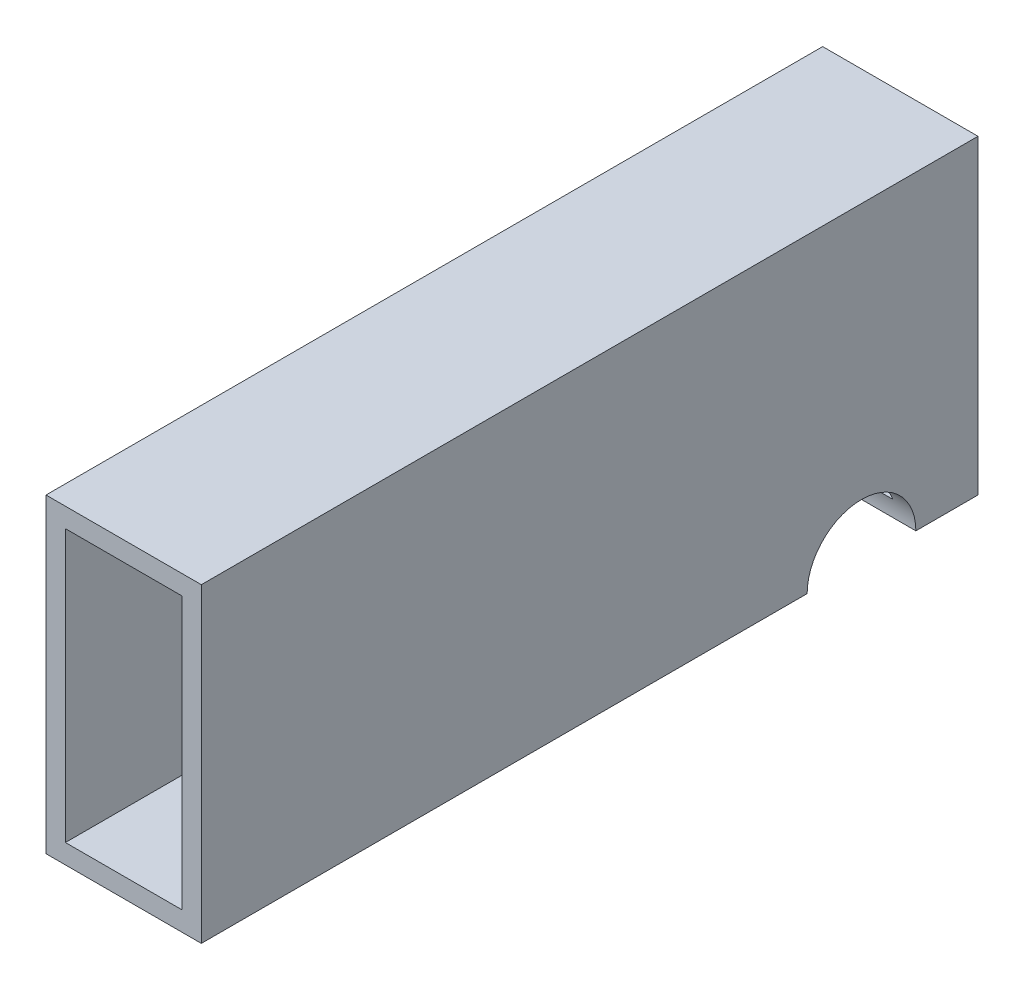
ISO-10303-21;
HEADER;
FILE_DESCRIPTION(('STEP AP214'),'2;1');
FILE_NAME('part.step','',(''),(''),'','','');
FILE_SCHEMA(('AUTOMOTIVE_DESIGN { 1 0 10303 214 1 1 1 1 }'));
ENDSEC;
DATA;
#1=APPLICATION_CONTEXT('core data for automotive mechanical design processes');
#2=APPLICATION_PROTOCOL_DEFINITION('international standard','automotive_design',2000,#1);
#3=PRODUCT_CONTEXT('',#1,'mechanical');
#4=PRODUCT('Part','Part','',(#3));
#5=PRODUCT_RELATED_PRODUCT_CATEGORY('part','',(#4));
#6=PRODUCT_DEFINITION_FORMATION('','',#4);
#7=PRODUCT_DEFINITION_CONTEXT('part definition',#1,'design');
#8=PRODUCT_DEFINITION('design','',#6,#7);
#9=PRODUCT_DEFINITION_SHAPE('','',#8);
#10=(LENGTH_UNIT() NAMED_UNIT(*) SI_UNIT(.MILLI.,.METRE.));
#11=(NAMED_UNIT(*) PLANE_ANGLE_UNIT() SI_UNIT($,.RADIAN.));
#12=(NAMED_UNIT(*) SI_UNIT($,.STERADIAN.) SOLID_ANGLE_UNIT());
#13=UNCERTAINTY_MEASURE_WITH_UNIT(LENGTH_MEASURE(1.E-05),#10,'distance_accuracy_value','');
#14=(GEOMETRIC_REPRESENTATION_CONTEXT(3) GLOBAL_UNCERTAINTY_ASSIGNED_CONTEXT((#13)) GLOBAL_UNIT_ASSIGNED_CONTEXT((#10,
#11,#12)) REPRESENTATION_CONTEXT('',''));
#15=CARTESIAN_POINT('',(0.,0.,0.));
#16=DIRECTION('',(0.,0.,1.));
#17=DIRECTION('',(1.,0.,0.));
#18=AXIS2_PLACEMENT_3D('',#15,#16,#17);
#19=CARTESIAN_POINT('',(-12.7,-25.4,63.5));
#20=DIRECTION('',(0.,1.,0.));
#21=DIRECTION('',(0.,0.,1.));
#22=AXIS2_PLACEMENT_3D('',#19,#20,#21);
#23=PLANE('',#22);
#24=DIRECTION('',(0.,0.,-1.));
#25=VECTOR('',#24,1.);
#26=CARTESIAN_POINT('',(-12.7,-25.4,63.5));
#27=LINE('',#26,#25);
#28=CARTESIAN_POINT('',(-12.7,-25.4,63.5));
#29=VERTEX_POINT('',#28);
#30=CARTESIAN_POINT('',(-12.7,-25.4,-35.56));
#31=VERTEX_POINT('',#30);
#32=EDGE_CURVE('E134',#29,#31,#27,.T.);
#33=ORIENTED_EDGE('',*,*,#32,.T.);
#34=DIRECTION('',(1.,0.,0.));
#35=VECTOR('',#34,1.);
#36=CARTESIAN_POINT('',(-12.7,-25.4,-35.56));
#37=LINE('',#36,#35);
#38=CARTESIAN_POINT('',(12.7,-25.4,-35.56));
#39=VERTEX_POINT('',#38);
#40=EDGE_CURVE('E118',#31,#39,#37,.T.);
#41=ORIENTED_EDGE('',*,*,#40,.T.);
#42=DIRECTION('',(0.,0.,-1.));
#43=VECTOR('',#42,1.);
#44=CARTESIAN_POINT('',(12.7,-25.4,63.5));
#45=LINE('',#44,#43);
#46=CARTESIAN_POINT('',(12.7,-25.4,63.5));
#47=VERTEX_POINT('',#46);
#48=EDGE_CURVE('E145',#47,#39,#45,.T.);
#49=ORIENTED_EDGE('',*,*,#48,.F.);
#50=DIRECTION('',(1.,0.,0.));
#51=VECTOR('',#50,1.);
#52=CARTESIAN_POINT('',(-12.7,-25.4,63.5));
#53=LINE('',#52,#51);
#54=EDGE_CURVE('E140',#29,#47,#53,.T.);
#55=ORIENTED_EDGE('',*,*,#54,.F.);
#56=EDGE_LOOP('',(#33,#41,#49,#55));
#57=FACE_BOUND('',#56,.T.);
#58=ADVANCED_FACE('F32',(#57),#23,.F.);
#59=CARTESIAN_POINT('',(-9.525,-22.225,63.5));
#60=DIRECTION('',(0.,1.,0.));
#61=DIRECTION('',(-1.,0.,0.));
#62=AXIS2_PLACEMENT_3D('',#59,#60,#61);
#63=PLANE('',#62);
#64=DIRECTION('',(1.,0.,0.));
#65=VECTOR('',#64,1.);
#66=CARTESIAN_POINT('',(-12.7,-22.225,-36.146297512555));
#67=LINE('',#66,#65);
#68=CARTESIAN_POINT('',(-9.525,-22.225,-36.146297512555));
#69=VERTEX_POINT('',#68);
#70=CARTESIAN_POINT('',(9.52500000000001,-22.225,-36.146297512555));
#71=VERTEX_POINT('',#70);
#72=EDGE_CURVE('E54',#69,#71,#67,.T.);
#73=ORIENTED_EDGE('',*,*,#72,.F.);
#74=DIRECTION('',(0.,0.,-1.));
#75=VECTOR('',#74,1.);
#76=CARTESIAN_POINT('',(-9.525,-22.225,63.5));
#77=LINE('',#76,#75);
#78=CARTESIAN_POINT('',(-9.525,-22.225,63.5));
#79=VERTEX_POINT('',#78);
#80=EDGE_CURVE('E166',#79,#69,#77,.T.);
#81=ORIENTED_EDGE('',*,*,#80,.F.);
#82=DIRECTION('',(1.,0.,0.));
#83=VECTOR('',#82,1.);
#84=CARTESIAN_POINT('',(-9.525,-22.225,63.5));
#85=LINE('',#84,#83);
#86=CARTESIAN_POINT('',(9.52500000000001,-22.225,63.5));
#87=VERTEX_POINT('',#86);
#88=EDGE_CURVE('E193',#79,#87,#85,.T.);
#89=ORIENTED_EDGE('',*,*,#88,.T.);
#90=DIRECTION('',(0.,0.,-1.));
#91=VECTOR('',#90,1.);
#92=CARTESIAN_POINT('',(9.52500000000001,-22.225,63.5));
#93=LINE('',#92,#91);
#94=EDGE_CURVE('E216',#87,#71,#93,.T.);
#95=ORIENTED_EDGE('',*,*,#94,.T.);
#96=EDGE_LOOP('',(#73,#81,#89,#95));
#97=FACE_BOUND('',#96,.T.);
#98=ADVANCED_FACE('F245',(#97),#63,.T.);
#99=CARTESIAN_POINT('',(0.,0.,63.5));
#100=DIRECTION('',(0.,0.,1.));
#101=DIRECTION('',(1.,0.,0.));
#102=AXIS2_PLACEMENT_3D('',#99,#100,#101);
#103=PLANE('',#102);
#104=DIRECTION('',(0.,1.,0.));
#105=VECTOR('',#104,1.);
#106=CARTESIAN_POINT('',(12.7,25.4,63.5));
#107=LINE('',#106,#105);
#108=CARTESIAN_POINT('',(12.7,25.4,63.5));
#109=VERTEX_POINT('',#108);
#110=EDGE_CURVE('E177',#47,#109,#107,.T.);
#111=ORIENTED_EDGE('',*,*,#110,.T.);
#112=DIRECTION('',(-1.,0.,0.));
#113=VECTOR('',#112,1.);
#114=CARTESIAN_POINT('',(-12.7,25.4,63.5));
#115=LINE('',#114,#113);
#116=CARTESIAN_POINT('',(-12.7,25.4,63.5));
#117=VERTEX_POINT('',#116);
#118=EDGE_CURVE('E155',#109,#117,#115,.T.);
#119=ORIENTED_EDGE('',*,*,#118,.T.);
#120=DIRECTION('',(0.,-1.,0.));
#121=VECTOR('',#120,1.);
#122=CARTESIAN_POINT('',(-12.7,25.4,63.5));
#123=LINE('',#122,#121);
#124=EDGE_CURVE('E181',#117,#29,#123,.T.);
#125=ORIENTED_EDGE('',*,*,#124,.T.);
#126=ORIENTED_EDGE('',*,*,#54,.T.);
#127=EDGE_LOOP('',(#111,#119,#125,#126));
#128=FACE_BOUND('',#127,.T.);
#129=ORIENTED_EDGE('',*,*,#88,.F.);
#130=DIRECTION('',(0.,-1.,0.));
#131=VECTOR('',#130,1.);
#132=CARTESIAN_POINT('',(-9.525,22.225,63.5));
#133=LINE('',#132,#131);
#134=CARTESIAN_POINT('',(-9.525,22.225,63.5));
#135=VERTEX_POINT('',#134);
#136=EDGE_CURVE('E191',#135,#79,#133,.T.);
#137=ORIENTED_EDGE('',*,*,#136,.F.);
#138=DIRECTION('',(-1.,0.,0.));
#139=VECTOR('',#138,1.);
#140=CARTESIAN_POINT('',(-9.525,22.225,63.5));
#141=LINE('',#140,#139);
#142=CARTESIAN_POINT('',(9.525,22.225,63.5));
#143=VERTEX_POINT('',#142);
#144=EDGE_CURVE('E199',#143,#135,#141,.T.);
#145=ORIENTED_EDGE('',*,*,#144,.F.);
#146=DIRECTION('',(0.,1.,0.));
#147=VECTOR('',#146,1.);
#148=CARTESIAN_POINT('',(9.525,22.225,63.5));
#149=LINE('',#148,#147);
#150=EDGE_CURVE('E196',#87,#143,#149,.T.);
#151=ORIENTED_EDGE('',*,*,#150,.F.);
#152=EDGE_LOOP('',(#129,#137,#145,#151));
#153=FACE_BOUND('',#152,.T.);
#154=ADVANCED_FACE('F243',(#128,#153),#103,.T.);
#155=CARTESIAN_POINT('',(0.,0.,-63.5));
#156=DIRECTION('',(0.,0.,1.));
#157=DIRECTION('',(1.,0.,0.));
#158=AXIS2_PLACEMENT_3D('',#155,#156,#157);
#159=PLANE('',#158);
#160=DIRECTION('',(0.,1.,0.));
#161=VECTOR('',#160,1.);
#162=CARTESIAN_POINT('',(12.7,25.4,-63.5));
#163=LINE('',#162,#161);
#164=CARTESIAN_POINT('',(12.7,-25.4,-63.5));
#165=VERTEX_POINT('',#164);
#166=CARTESIAN_POINT('',(12.7,25.4,-63.5));
#167=VERTEX_POINT('',#166);
#168=EDGE_CURVE('E160',#165,#167,#163,.T.);
#169=ORIENTED_EDGE('',*,*,#168,.F.);
#170=DIRECTION('',(1.,0.,0.));
#171=VECTOR('',#170,1.);
#172=CARTESIAN_POINT('',(-12.7,-25.4,-63.5));
#173=LINE('',#172,#171);
#174=CARTESIAN_POINT('',(-12.7,-25.4,-63.5));
#175=VERTEX_POINT('',#174);
#176=EDGE_CURVE('E176',#175,#165,#173,.T.);
#177=ORIENTED_EDGE('',*,*,#176,.F.);
#178=DIRECTION('',(0.,-1.,0.));
#179=VECTOR('',#178,1.);
#180=CARTESIAN_POINT('',(-12.7,25.4,-63.5));
#181=LINE('',#180,#179);
#182=CARTESIAN_POINT('',(-12.7,25.4,-63.5));
#183=VERTEX_POINT('',#182);
#184=EDGE_CURVE('E168',#183,#175,#181,.T.);
#185=ORIENTED_EDGE('',*,*,#184,.F.);
#186=DIRECTION('',(-1.,0.,0.));
#187=VECTOR('',#186,1.);
#188=CARTESIAN_POINT('',(-12.7,25.4,-63.5));
#189=LINE('',#188,#187);
#190=EDGE_CURVE('E154',#167,#183,#189,.T.);
#191=ORIENTED_EDGE('',*,*,#190,.F.);
#192=EDGE_LOOP('',(#169,#177,#185,#191));
#193=FACE_BOUND('',#192,.T.);
#194=DIRECTION('',(0.,-1.,0.));
#195=VECTOR('',#194,1.);
#196=CARTESIAN_POINT('',(-9.525,22.225,-63.5));
#197=LINE('',#196,#195);
#198=CARTESIAN_POINT('',(-9.525,22.225,-63.5));
#199=VERTEX_POINT('',#198);
#200=CARTESIAN_POINT('',(-9.525,-22.225,-63.5));
#201=VERTEX_POINT('',#200);
#202=EDGE_CURVE('E126',#199,#201,#197,.T.);
#203=ORIENTED_EDGE('',*,*,#202,.T.);
#204=DIRECTION('',(1.,0.,0.));
#205=VECTOR('',#204,1.);
#206=CARTESIAN_POINT('',(-9.525,-22.225,-63.5));
#207=LINE('',#206,#205);
#208=CARTESIAN_POINT('',(9.52500000000001,-22.225,-63.5));
#209=VERTEX_POINT('',#208);
#210=EDGE_CURVE('E204',#201,#209,#207,.T.);
#211=ORIENTED_EDGE('',*,*,#210,.T.);
#212=DIRECTION('',(0.,1.,0.));
#213=VECTOR('',#212,1.);
#214=CARTESIAN_POINT('',(9.525,22.225,-63.5));
#215=LINE('',#214,#213);
#216=CARTESIAN_POINT('',(9.525,22.225,-63.5));
#217=VERTEX_POINT('',#216);
#218=EDGE_CURVE('E207',#209,#217,#215,.T.);
#219=ORIENTED_EDGE('',*,*,#218,.T.);
#220=DIRECTION('',(-1.,0.,0.));
#221=VECTOR('',#220,1.);
#222=CARTESIAN_POINT('',(-9.525,22.225,-63.5));
#223=LINE('',#222,#221);
#224=EDGE_CURVE('E194',#217,#199,#223,.T.);
#225=ORIENTED_EDGE('',*,*,#224,.T.);
#226=EDGE_LOOP('',(#203,#211,#219,#225));
#227=FACE_BOUND('',#226,.T.);
#228=ADVANCED_FACE('F231',(#193,#227),#159,.F.);
#229=CARTESIAN_POINT('',(12.7,25.4,63.5));
#230=DIRECTION('',(-1.,0.,0.));
#231=DIRECTION('',(0.,-1.,0.));
#232=AXIS2_PLACEMENT_3D('',#229,#230,#231);
#233=PLANE('',#232);
#234=ORIENTED_EDGE('',*,*,#48,.T.);
#235=CARTESIAN_POINT('',(12.7,-25.4,-44.45));
#236=DIRECTION('',(1.,0.,0.));
#237=DIRECTION('',(0.,1.,0.));
#238=AXIS2_PLACEMENT_3D('',#235,#236,#237);
#239=CIRCLE('',#238,8.88999999999999);
#240=CARTESIAN_POINT('',(12.7,-25.4,-53.34));
#241=VERTEX_POINT('',#240);
#242=EDGE_CURVE('E121',#241,#39,#239,.T.);
#243=ORIENTED_EDGE('',*,*,#242,.F.);
#244=EDGE_CURVE('E162',#241,#165,#45,.T.);
#245=ORIENTED_EDGE('',*,*,#244,.T.);
#246=ORIENTED_EDGE('',*,*,#168,.T.);
#247=DIRECTION('',(0.,0.,-1.));
#248=VECTOR('',#247,1.);
#249=CARTESIAN_POINT('',(12.7,25.4,63.5));
#250=LINE('',#249,#248);
#251=EDGE_CURVE('E40',#109,#167,#250,.T.);
#252=ORIENTED_EDGE('',*,*,#251,.F.);
#253=ORIENTED_EDGE('',*,*,#110,.F.);
#254=EDGE_LOOP('',(#234,#243,#245,#246,#252,#253));
#255=FACE_BOUND('',#254,.T.);
#256=ADVANCED_FACE('F34',(#255),#233,.F.);
#257=CARTESIAN_POINT('',(-12.7,25.4,63.5));
#258=DIRECTION('',(0.,-1.,0.));
#259=DIRECTION('',(0.,0.,-1.));
#260=AXIS2_PLACEMENT_3D('',#257,#258,#259);
#261=PLANE('',#260);
#262=ORIENTED_EDGE('',*,*,#190,.T.);
#263=DIRECTION('',(0.,0.,-1.));
#264=VECTOR('',#263,1.);
#265=CARTESIAN_POINT('',(-12.7,25.4,63.5));
#266=LINE('',#265,#264);
#267=EDGE_CURVE('E141',#117,#183,#266,.T.);
#268=ORIENTED_EDGE('',*,*,#267,.F.);
#269=ORIENTED_EDGE('',*,*,#118,.F.);
#270=ORIENTED_EDGE('',*,*,#251,.T.);
#271=EDGE_LOOP('',(#262,#268,#269,#270));
#272=FACE_BOUND('',#271,.T.);
#273=ADVANCED_FACE('F152',(#272),#261,.F.);
#274=CARTESIAN_POINT('',(-12.7,25.4,63.5));
#275=DIRECTION('',(1.,0.,0.));
#276=DIRECTION('',(0.,1.,0.));
#277=AXIS2_PLACEMENT_3D('',#274,#275,#276);
#278=PLANE('',#277);
#279=CARTESIAN_POINT('',(-12.7,-25.4,-53.34));
#280=VERTEX_POINT('',#279);
#281=EDGE_CURVE('E137',#280,#175,#27,.T.);
#282=ORIENTED_EDGE('',*,*,#281,.F.);
#283=CARTESIAN_POINT('',(-12.7,-25.4,-44.45));
#284=DIRECTION('',(1.,0.,0.));
#285=DIRECTION('',(0.,1.,0.));
#286=AXIS2_PLACEMENT_3D('',#283,#284,#285);
#287=CIRCLE('',#286,8.88999999999999);
#288=EDGE_CURVE('E47',#280,#31,#287,.T.);
#289=ORIENTED_EDGE('',*,*,#288,.T.);
#290=ORIENTED_EDGE('',*,*,#32,.F.);
#291=ORIENTED_EDGE('',*,*,#124,.F.);
#292=ORIENTED_EDGE('',*,*,#267,.T.);
#293=ORIENTED_EDGE('',*,*,#184,.T.);
#294=EDGE_LOOP('',(#282,#289,#290,#291,#292,#293));
#295=FACE_BOUND('',#294,.T.);
#296=ADVANCED_FACE('F132',(#295),#278,.F.);
#297=ORIENTED_EDGE('',*,*,#244,.F.);
#298=DIRECTION('',(1.,0.,0.));
#299=VECTOR('',#298,1.);
#300=CARTESIAN_POINT('',(-12.7,-25.4,-53.34));
#301=LINE('',#300,#299);
#302=EDGE_CURVE('E127',#241,#280,#301,.F.);
#303=ORIENTED_EDGE('',*,*,#302,.T.);
#304=ORIENTED_EDGE('',*,*,#281,.T.);
#305=ORIENTED_EDGE('',*,*,#176,.T.);
#306=EDGE_LOOP('',(#297,#303,#304,#305));
#307=FACE_BOUND('',#306,.T.);
#308=ADVANCED_FACE('F185',(#307),#23,.F.);
#309=CARTESIAN_POINT('',(-9.525,22.225,63.5));
#310=DIRECTION('',(1.,0.,0.));
#311=DIRECTION('',(0.,1.,0.));
#312=AXIS2_PLACEMENT_3D('',#309,#310,#311);
#313=PLANE('',#312);
#314=CARTESIAN_POINT('',(-9.525,-25.4,-44.45));
#315=DIRECTION('',(1.,0.,0.));
#316=DIRECTION('',(0.,1.,0.));
#317=AXIS2_PLACEMENT_3D('',#314,#315,#316);
#318=CIRCLE('',#317,8.88999999999999);
#319=CARTESIAN_POINT('',(-9.525,-22.225,-52.753702487445));
#320=VERTEX_POINT('',#319);
#321=EDGE_CURVE('E186',#320,#69,#318,.T.);
#322=ORIENTED_EDGE('',*,*,#321,.F.);
#323=EDGE_CURVE('E171',#320,#201,#77,.T.);
#324=ORIENTED_EDGE('',*,*,#323,.T.);
#325=ORIENTED_EDGE('',*,*,#202,.F.);
#326=DIRECTION('',(0.,0.,-1.));
#327=VECTOR('',#326,1.);
#328=CARTESIAN_POINT('',(-9.525,22.225,63.5));
#329=LINE('',#328,#327);
#330=EDGE_CURVE('E201',#135,#199,#329,.T.);
#331=ORIENTED_EDGE('',*,*,#330,.F.);
#332=ORIENTED_EDGE('',*,*,#136,.T.);
#333=ORIENTED_EDGE('',*,*,#80,.T.);
#334=EDGE_LOOP('',(#322,#324,#325,#331,#332,#333));
#335=FACE_BOUND('',#334,.T.);
#336=ADVANCED_FACE('F235',(#335),#313,.T.);
#337=DIRECTION('',(1.,0.,0.));
#338=VECTOR('',#337,1.);
#339=CARTESIAN_POINT('',(-12.7,-22.225,-52.753702487445));
#340=LINE('',#339,#338);
#341=CARTESIAN_POINT('',(9.52500000000001,-22.225,-52.753702487445));
#342=VERTEX_POINT('',#341);
#343=EDGE_CURVE('E138',#342,#320,#340,.F.);
#344=ORIENTED_EDGE('',*,*,#343,.F.);
#345=EDGE_CURVE('E215',#342,#209,#93,.T.);
#346=ORIENTED_EDGE('',*,*,#345,.T.);
#347=ORIENTED_EDGE('',*,*,#210,.F.);
#348=ORIENTED_EDGE('',*,*,#323,.F.);
#349=EDGE_LOOP('',(#344,#346,#347,#348));
#350=FACE_BOUND('',#349,.T.);
#351=ADVANCED_FACE('F225',(#350),#63,.T.);
#352=CARTESIAN_POINT('',(9.525,22.225,63.5));
#353=DIRECTION('',(-1.,0.,0.));
#354=DIRECTION('',(0.,-1.,0.));
#355=AXIS2_PLACEMENT_3D('',#352,#353,#354);
#356=PLANE('',#355);
#357=CARTESIAN_POINT('',(9.52500000000001,-25.4,-44.45));
#358=DIRECTION('',(-1.,0.,0.));
#359=DIRECTION('',(0.,-1.,0.));
#360=AXIS2_PLACEMENT_3D('',#357,#358,#359);
#361=CIRCLE('',#360,8.88999999999999);
#362=EDGE_CURVE('E11',#71,#342,#361,.T.);
#363=ORIENTED_EDGE('',*,*,#362,.F.);
#364=ORIENTED_EDGE('',*,*,#94,.F.);
#365=ORIENTED_EDGE('',*,*,#150,.T.);
#366=DIRECTION('',(0.,0.,-1.));
#367=VECTOR('',#366,1.);
#368=CARTESIAN_POINT('',(9.525,22.225,63.5));
#369=LINE('',#368,#367);
#370=EDGE_CURVE('E214',#143,#217,#369,.T.);
#371=ORIENTED_EDGE('',*,*,#370,.T.);
#372=ORIENTED_EDGE('',*,*,#218,.F.);
#373=ORIENTED_EDGE('',*,*,#345,.F.);
#374=EDGE_LOOP('',(#363,#364,#365,#371,#372,#373));
#375=FACE_BOUND('',#374,.T.);
#376=ADVANCED_FACE('F228',(#375),#356,.T.);
#377=CARTESIAN_POINT('',(-9.525,22.225,63.5));
#378=DIRECTION('',(0.,-1.,0.));
#379=DIRECTION('',(0.,0.,-1.));
#380=AXIS2_PLACEMENT_3D('',#377,#378,#379);
#381=PLANE('',#380);
#382=ORIENTED_EDGE('',*,*,#224,.F.);
#383=ORIENTED_EDGE('',*,*,#370,.F.);
#384=ORIENTED_EDGE('',*,*,#144,.T.);
#385=ORIENTED_EDGE('',*,*,#330,.T.);
#386=EDGE_LOOP('',(#382,#383,#384,#385));
#387=FACE_BOUND('',#386,.T.);
#388=ADVANCED_FACE('F238',(#387),#381,.T.);
#389=CARTESIAN_POINT('',(-12.7,-25.4,-44.45));
#390=DIRECTION('',(1.,0.,0.));
#391=DIRECTION('',(0.,1.,0.));
#392=AXIS2_PLACEMENT_3D('',#389,#390,#391);
#393=CYLINDRICAL_SURFACE('',#392,8.88999999999999);
#394=ORIENTED_EDGE('',*,*,#321,.T.);
#395=ORIENTED_EDGE('',*,*,#72,.T.);
#396=ORIENTED_EDGE('',*,*,#362,.T.);
#397=ORIENTED_EDGE('',*,*,#343,.T.);
#398=EDGE_LOOP('',(#394,#395,#396,#397));
#399=FACE_BOUND('',#398,.T.);
#400=ORIENTED_EDGE('',*,*,#288,.F.);
#401=ORIENTED_EDGE('',*,*,#302,.F.);
#402=ORIENTED_EDGE('',*,*,#242,.T.);
#403=ORIENTED_EDGE('',*,*,#40,.F.);
#404=EDGE_LOOP('',(#400,#401,#402,#403));
#405=FACE_BOUND('',#404,.T.);
#406=ADVANCED_FACE('F119',(#399,#405),#393,.F.);
#407=CLOSED_SHELL('',(#58,#98,#154,#228,#256,#273,#296,#308,#336,#351,#376,#388,#406));
#408=MANIFOLD_SOLID_BREP('B2',#407);
#409=ADVANCED_BREP_SHAPE_REPRESENTATION('',(#18,#408),#14);
#410=SHAPE_DEFINITION_REPRESENTATION(#9,#409);
ENDSEC;
END-ISO-10303-21;
